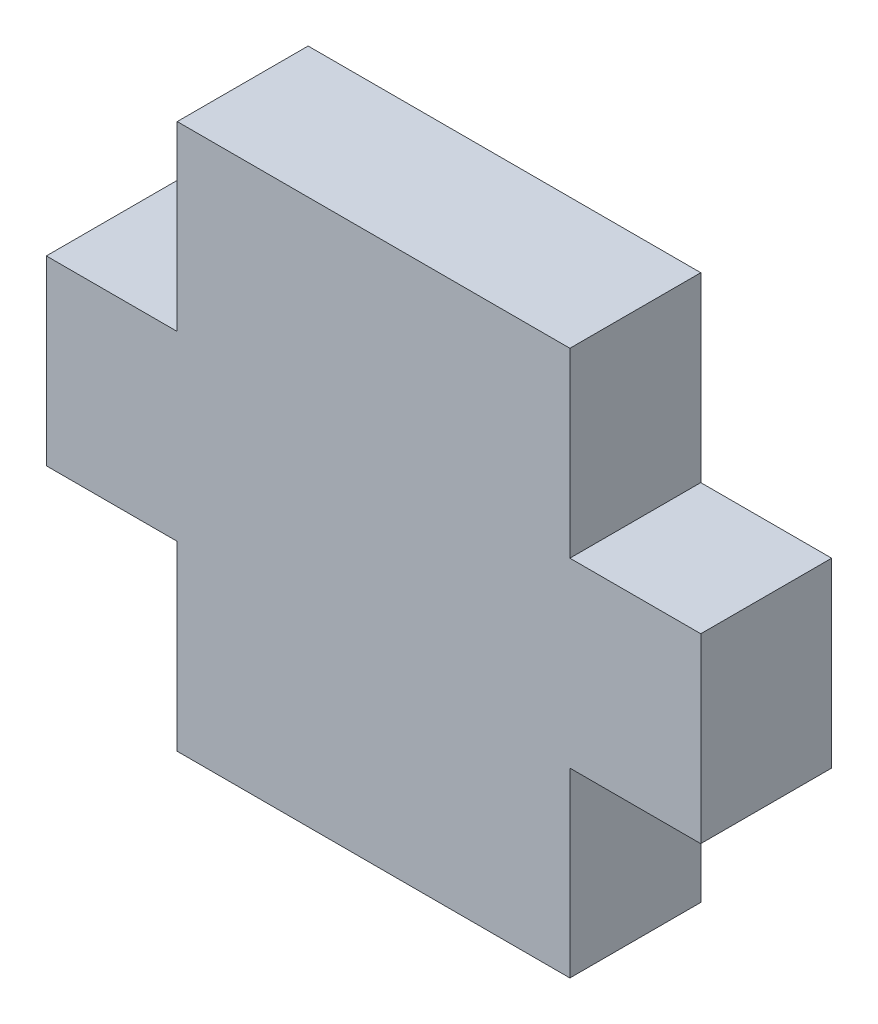
ISO-10303-21;
HEADER;
FILE_DESCRIPTION(('STEP AP214'),'2;1');
FILE_NAME('part.step','',(''),(''),'','','');
FILE_SCHEMA(('AUTOMOTIVE_DESIGN { 1 0 10303 214 1 1 1 1 }'));
ENDSEC;
DATA;
#1=APPLICATION_CONTEXT('core data for automotive mechanical design processes');
#2=APPLICATION_PROTOCOL_DEFINITION('international standard','automotive_design',2000,#1);
#3=PRODUCT_CONTEXT('',#1,'mechanical');
#4=PRODUCT('Part','Part','',(#3));
#5=PRODUCT_RELATED_PRODUCT_CATEGORY('part','',(#4));
#6=PRODUCT_DEFINITION_FORMATION('','',#4);
#7=PRODUCT_DEFINITION_CONTEXT('part definition',#1,'design');
#8=PRODUCT_DEFINITION('design','',#6,#7);
#9=PRODUCT_DEFINITION_SHAPE('','',#8);
#10=(LENGTH_UNIT() NAMED_UNIT(*) SI_UNIT(.MILLI.,.METRE.));
#11=(NAMED_UNIT(*) PLANE_ANGLE_UNIT() SI_UNIT($,.RADIAN.));
#12=(NAMED_UNIT(*) SI_UNIT($,.STERADIAN.) SOLID_ANGLE_UNIT());
#13=UNCERTAINTY_MEASURE_WITH_UNIT(LENGTH_MEASURE(1.E-05),#10,'distance_accuracy_value','');
#14=(GEOMETRIC_REPRESENTATION_CONTEXT(3) GLOBAL_UNCERTAINTY_ASSIGNED_CONTEXT((#13)) GLOBAL_UNIT_ASSIGNED_CONTEXT((#10,
#11,#12)) REPRESENTATION_CONTEXT('',''));
#15=CARTESIAN_POINT('',(0.,0.,0.));
#16=DIRECTION('',(0.,0.,1.));
#17=DIRECTION('',(1.,0.,0.));
#18=AXIS2_PLACEMENT_3D('',#15,#16,#17);
#19=CARTESIAN_POINT('',(0.,0.,15.24));
#20=DIRECTION('',(1.,0.,0.));
#21=DIRECTION('',(0.,0.,-1.));
#22=AXIS2_PLACEMENT_3D('',#19,#20,#21);
#23=PLANE('',#22);
#24=DIRECTION('',(0.,-1.,0.));
#25=VECTOR('',#24,1.);
#26=CARTESIAN_POINT('',(0.,0.,0.));
#27=LINE('',#26,#25);
#28=CARTESIAN_POINT('',(0.,42.3333333333333,0.));
#29=VERTEX_POINT('',#28);
#30=CARTESIAN_POINT('',(0.,21.1666666666667,0.));
#31=VERTEX_POINT('',#30);
#32=EDGE_CURVE('E150',#29,#31,#27,.T.);
#33=ORIENTED_EDGE('',*,*,#32,.T.);
#34=DIRECTION('',(0.,0.,1.));
#35=VECTOR('',#34,1.);
#36=CARTESIAN_POINT('',(0.,21.1666666666667,0.));
#37=LINE('',#36,#35);
#38=CARTESIAN_POINT('',(0.,21.1666666666667,15.24));
#39=VERTEX_POINT('',#38);
#40=EDGE_CURVE('E175',#31,#39,#37,.T.);
#41=ORIENTED_EDGE('',*,*,#40,.T.);
#42=DIRECTION('',(0.,-1.,0.));
#43=VECTOR('',#42,1.);
#44=CARTESIAN_POINT('',(0.,0.,15.24));
#45=LINE('',#44,#43);
#46=CARTESIAN_POINT('',(0.,42.3333333333333,15.24));
#47=VERTEX_POINT('',#46);
#48=EDGE_CURVE('E148',#47,#39,#45,.T.);
#49=ORIENTED_EDGE('',*,*,#48,.F.);
#50=DIRECTION('',(0.,0.,1.));
#51=VECTOR('',#50,1.);
#52=CARTESIAN_POINT('',(0.,42.3333333333333,0.));
#53=LINE('',#52,#51);
#54=EDGE_CURVE('E162',#29,#47,#53,.T.);
#55=ORIENTED_EDGE('',*,*,#54,.F.);
#56=EDGE_LOOP('',(#33,#41,#49,#55));
#57=FACE_BOUND('',#56,.T.);
#58=ADVANCED_FACE('F33',(#57),#23,.F.);
#59=CARTESIAN_POINT('',(0.,0.,15.24));
#60=DIRECTION('',(0.,1.,0.));
#61=DIRECTION('',(0.,0.,1.));
#62=AXIS2_PLACEMENT_3D('',#59,#60,#61);
#63=PLANE('',#62);
#64=DIRECTION('',(1.,0.,0.));
#65=VECTOR('',#64,1.);
#66=CARTESIAN_POINT('',(0.,0.,15.24));
#67=LINE('',#66,#65);
#68=CARTESIAN_POINT('',(15.24,0.,15.24));
#69=VERTEX_POINT('',#68);
#70=CARTESIAN_POINT('',(60.96,0.,15.24));
#71=VERTEX_POINT('',#70);
#72=EDGE_CURVE('E157',#69,#71,#67,.T.);
#73=ORIENTED_EDGE('',*,*,#72,.F.);
#74=DIRECTION('',(0.,0.,1.));
#75=VECTOR('',#74,1.);
#76=CARTESIAN_POINT('',(15.24,0.,0.));
#77=LINE('',#76,#75);
#78=CARTESIAN_POINT('',(15.24,0.,0.));
#79=VERTEX_POINT('',#78);
#80=EDGE_CURVE('E196',#79,#69,#77,.T.);
#81=ORIENTED_EDGE('',*,*,#80,.F.);
#82=DIRECTION('',(1.,0.,0.));
#83=VECTOR('',#82,1.);
#84=CARTESIAN_POINT('',(0.,0.,0.));
#85=LINE('',#84,#83);
#86=CARTESIAN_POINT('',(60.96,0.,0.));
#87=VERTEX_POINT('',#86);
#88=EDGE_CURVE('E146',#79,#87,#85,.T.);
#89=ORIENTED_EDGE('',*,*,#88,.T.);
#90=DIRECTION('',(0.,0.,1.));
#91=VECTOR('',#90,1.);
#92=CARTESIAN_POINT('',(60.96,0.,0.));
#93=LINE('',#92,#91);
#94=EDGE_CURVE('E193',#87,#71,#93,.T.);
#95=ORIENTED_EDGE('',*,*,#94,.T.);
#96=EDGE_LOOP('',(#73,#81,#89,#95));
#97=FACE_BOUND('',#96,.T.);
#98=ADVANCED_FACE('F221',(#97),#63,.F.);
#99=CARTESIAN_POINT('',(76.2,0.,15.24));
#100=DIRECTION('',(-1.,0.,0.));
#101=DIRECTION('',(0.,0.,1.));
#102=AXIS2_PLACEMENT_3D('',#99,#100,#101);
#103=PLANE('',#102);
#104=DIRECTION('',(0.,1.,0.));
#105=VECTOR('',#104,1.);
#106=CARTESIAN_POINT('',(76.2,0.,0.));
#107=LINE('',#106,#105);
#108=CARTESIAN_POINT('',(76.2,21.1666666666667,0.));
#109=VERTEX_POINT('',#108);
#110=CARTESIAN_POINT('',(76.2,42.3333333333333,0.));
#111=VERTEX_POINT('',#110);
#112=EDGE_CURVE('E141',#109,#111,#107,.T.);
#113=ORIENTED_EDGE('',*,*,#112,.T.);
#114=DIRECTION('',(0.,0.,1.));
#115=VECTOR('',#114,1.);
#116=CARTESIAN_POINT('',(76.2,42.3333333333333,0.));
#117=LINE('',#116,#115);
#118=CARTESIAN_POINT('',(76.2,42.3333333333333,15.24));
#119=VERTEX_POINT('',#118);
#120=EDGE_CURVE('E184',#111,#119,#117,.T.);
#121=ORIENTED_EDGE('',*,*,#120,.T.);
#122=DIRECTION('',(0.,1.,0.));
#123=VECTOR('',#122,1.);
#124=CARTESIAN_POINT('',(76.2,0.,15.24));
#125=LINE('',#124,#123);
#126=CARTESIAN_POINT('',(76.2,21.1666666666667,15.24));
#127=VERTEX_POINT('',#126);
#128=EDGE_CURVE('E41',#127,#119,#125,.T.);
#129=ORIENTED_EDGE('',*,*,#128,.F.);
#130=DIRECTION('',(0.,0.,1.));
#131=VECTOR('',#130,1.);
#132=CARTESIAN_POINT('',(76.2,21.1666666666667,0.));
#133=LINE('',#132,#131);
#134=EDGE_CURVE('E127',#109,#127,#133,.T.);
#135=ORIENTED_EDGE('',*,*,#134,.F.);
#136=EDGE_LOOP('',(#113,#121,#129,#135));
#137=FACE_BOUND('',#136,.T.);
#138=ADVANCED_FACE('F139',(#137),#103,.F.);
#139=CARTESIAN_POINT('',(0.,63.5,15.24));
#140=DIRECTION('',(0.,-1.,0.));
#141=DIRECTION('',(0.,0.,-1.));
#142=AXIS2_PLACEMENT_3D('',#139,#140,#141);
#143=PLANE('',#142);
#144=DIRECTION('',(-1.,0.,0.));
#145=VECTOR('',#144,1.);
#146=CARTESIAN_POINT('',(0.,63.5,15.24));
#147=LINE('',#146,#145);
#148=CARTESIAN_POINT('',(60.96,63.5,15.24));
#149=VERTEX_POINT('',#148);
#150=CARTESIAN_POINT('',(15.24,63.5,15.24));
#151=VERTEX_POINT('',#150);
#152=EDGE_CURVE('E11',#149,#151,#147,.T.);
#153=ORIENTED_EDGE('',*,*,#152,.F.);
#154=DIRECTION('',(0.,0.,1.));
#155=VECTOR('',#154,1.);
#156=CARTESIAN_POINT('',(60.96,63.5,0.));
#157=LINE('',#156,#155);
#158=CARTESIAN_POINT('',(60.96,63.5,0.));
#159=VERTEX_POINT('',#158);
#160=EDGE_CURVE('E180',#159,#149,#157,.T.);
#161=ORIENTED_EDGE('',*,*,#160,.F.);
#162=DIRECTION('',(-1.,0.,0.));
#163=VECTOR('',#162,1.);
#164=CARTESIAN_POINT('',(0.,63.5,0.));
#165=LINE('',#164,#163);
#166=CARTESIAN_POINT('',(15.24,63.5,0.));
#167=VERTEX_POINT('',#166);
#168=EDGE_CURVE('E36',#159,#167,#165,.T.);
#169=ORIENTED_EDGE('',*,*,#168,.T.);
#170=DIRECTION('',(0.,0.,1.));
#171=VECTOR('',#170,1.);
#172=CARTESIAN_POINT('',(15.24,63.5,0.));
#173=LINE('',#172,#171);
#174=EDGE_CURVE('E154',#167,#151,#173,.T.);
#175=ORIENTED_EDGE('',*,*,#174,.T.);
#176=EDGE_LOOP('',(#153,#161,#169,#175));
#177=FACE_BOUND('',#176,.T.);
#178=ADVANCED_FACE('F244',(#177),#143,.F.);
#179=CARTESIAN_POINT('',(0.,0.,15.24));
#180=DIRECTION('',(0.,0.,-1.));
#181=DIRECTION('',(-1.,0.,0.));
#182=AXIS2_PLACEMENT_3D('',#179,#180,#181);
#183=PLANE('',#182);
#184=ORIENTED_EDGE('',*,*,#48,.T.);
#185=DIRECTION('',(-1.,0.,0.));
#186=VECTOR('',#185,1.);
#187=CARTESIAN_POINT('',(0.,21.1666666666667,15.24));
#188=LINE('',#187,#186);
#189=CARTESIAN_POINT('',(15.24,21.1666666666667,15.24));
#190=VERTEX_POINT('',#189);
#191=EDGE_CURVE('E202',#190,#39,#188,.T.);
#192=ORIENTED_EDGE('',*,*,#191,.F.);
#193=DIRECTION('',(0.,1.,0.));
#194=VECTOR('',#193,1.);
#195=CARTESIAN_POINT('',(15.24,0.,15.24));
#196=LINE('',#195,#194);
#197=EDGE_CURVE('E186',#69,#190,#196,.T.);
#198=ORIENTED_EDGE('',*,*,#197,.F.);
#199=ORIENTED_EDGE('',*,*,#72,.T.);
#200=DIRECTION('',(0.,-1.,0.));
#201=VECTOR('',#200,1.);
#202=CARTESIAN_POINT('',(60.96,21.1666666666667,15.24));
#203=LINE('',#202,#201);
#204=CARTESIAN_POINT('',(60.96,21.1666666666667,15.24));
#205=VERTEX_POINT('',#204);
#206=EDGE_CURVE('E134',#205,#71,#203,.T.);
#207=ORIENTED_EDGE('',*,*,#206,.F.);
#208=DIRECTION('',(-1.,0.,0.));
#209=VECTOR('',#208,1.);
#210=CARTESIAN_POINT('',(76.2,21.1666666666667,15.24));
#211=LINE('',#210,#209);
#212=EDGE_CURVE('E214',#127,#205,#211,.T.);
#213=ORIENTED_EDGE('',*,*,#212,.F.);
#214=ORIENTED_EDGE('',*,*,#128,.T.);
#215=DIRECTION('',(1.,0.,0.));
#216=VECTOR('',#215,1.);
#217=CARTESIAN_POINT('',(76.2,42.3333333333333,15.24));
#218=LINE('',#217,#216);
#219=CARTESIAN_POINT('',(60.96,42.3333333333333,15.24));
#220=VERTEX_POINT('',#219);
#221=EDGE_CURVE('E187',#220,#119,#218,.T.);
#222=ORIENTED_EDGE('',*,*,#221,.F.);
#223=DIRECTION('',(0.,-1.,0.));
#224=VECTOR('',#223,1.);
#225=CARTESIAN_POINT('',(60.96,63.5,15.24));
#226=LINE('',#225,#224);
#227=EDGE_CURVE('E190',#149,#220,#226,.T.);
#228=ORIENTED_EDGE('',*,*,#227,.F.);
#229=ORIENTED_EDGE('',*,*,#152,.T.);
#230=DIRECTION('',(0.,1.,0.));
#231=VECTOR('',#230,1.);
#232=CARTESIAN_POINT('',(15.24,63.5,15.24));
#233=LINE('',#232,#231);
#234=CARTESIAN_POINT('',(15.24,42.3333333333333,15.24));
#235=VERTEX_POINT('',#234);
#236=EDGE_CURVE('E169',#235,#151,#233,.T.);
#237=ORIENTED_EDGE('',*,*,#236,.F.);
#238=DIRECTION('',(1.,0.,0.));
#239=VECTOR('',#238,1.);
#240=CARTESIAN_POINT('',(0.,42.3333333333333,15.24));
#241=LINE('',#240,#239);
#242=EDGE_CURVE('E172',#47,#235,#241,.T.);
#243=ORIENTED_EDGE('',*,*,#242,.F.);
#244=EDGE_LOOP('',(#184,#192,#198,#199,#207,#213,#214,#222,#228,#229,#237,#243));
#245=FACE_BOUND('',#244,.T.);
#246=ADVANCED_FACE('F227',(#245),#183,.F.);
#247=CARTESIAN_POINT('',(0.,0.,0.));
#248=DIRECTION('',(0.,0.,-1.));
#249=DIRECTION('',(-1.,0.,0.));
#250=AXIS2_PLACEMENT_3D('',#247,#248,#249);
#251=PLANE('',#250);
#252=DIRECTION('',(-1.,0.,0.));
#253=VECTOR('',#252,1.);
#254=CARTESIAN_POINT('',(0.,21.1666666666667,0.));
#255=LINE('',#254,#253);
#256=CARTESIAN_POINT('',(15.24,21.1666666666667,0.));
#257=VERTEX_POINT('',#256);
#258=EDGE_CURVE('E49',#257,#31,#255,.T.);
#259=ORIENTED_EDGE('',*,*,#258,.T.);
#260=ORIENTED_EDGE('',*,*,#32,.F.);
#261=DIRECTION('',(1.,0.,0.));
#262=VECTOR('',#261,1.);
#263=CARTESIAN_POINT('',(0.,42.3333333333333,0.));
#264=LINE('',#263,#262);
#265=CARTESIAN_POINT('',(15.24,42.3333333333333,0.));
#266=VERTEX_POINT('',#265);
#267=EDGE_CURVE('E171',#29,#266,#264,.T.);
#268=ORIENTED_EDGE('',*,*,#267,.T.);
#269=DIRECTION('',(0.,1.,0.));
#270=VECTOR('',#269,1.);
#271=CARTESIAN_POINT('',(15.24,63.5,0.));
#272=LINE('',#271,#270);
#273=EDGE_CURVE('E165',#266,#167,#272,.T.);
#274=ORIENTED_EDGE('',*,*,#273,.T.);
#275=ORIENTED_EDGE('',*,*,#168,.F.);
#276=DIRECTION('',(0.,-1.,0.));
#277=VECTOR('',#276,1.);
#278=CARTESIAN_POINT('',(60.96,63.5,0.));
#279=LINE('',#278,#277);
#280=CARTESIAN_POINT('',(60.96,42.3333333333333,0.));
#281=VERTEX_POINT('',#280);
#282=EDGE_CURVE('E189',#159,#281,#279,.T.);
#283=ORIENTED_EDGE('',*,*,#282,.T.);
#284=DIRECTION('',(1.,0.,0.));
#285=VECTOR('',#284,1.);
#286=CARTESIAN_POINT('',(76.2,42.3333333333333,0.));
#287=LINE('',#286,#285);
#288=EDGE_CURVE('E57',#281,#111,#287,.T.);
#289=ORIENTED_EDGE('',*,*,#288,.T.);
#290=ORIENTED_EDGE('',*,*,#112,.F.);
#291=DIRECTION('',(-1.,0.,0.));
#292=VECTOR('',#291,1.);
#293=CARTESIAN_POINT('',(76.2,21.1666666666667,0.));
#294=LINE('',#293,#292);
#295=CARTESIAN_POINT('',(60.96,21.1666666666667,0.));
#296=VERTEX_POINT('',#295);
#297=EDGE_CURVE('E123',#109,#296,#294,.T.);
#298=ORIENTED_EDGE('',*,*,#297,.T.);
#299=DIRECTION('',(0.,-1.,0.));
#300=VECTOR('',#299,1.);
#301=CARTESIAN_POINT('',(60.96,21.1666666666667,0.));
#302=LINE('',#301,#300);
#303=EDGE_CURVE('E133',#296,#87,#302,.T.);
#304=ORIENTED_EDGE('',*,*,#303,.T.);
#305=ORIENTED_EDGE('',*,*,#88,.F.);
#306=DIRECTION('',(0.,1.,0.));
#307=VECTOR('',#306,1.);
#308=CARTESIAN_POINT('',(15.24,0.,0.));
#309=LINE('',#308,#307);
#310=EDGE_CURVE('E204',#79,#257,#309,.T.);
#311=ORIENTED_EDGE('',*,*,#310,.T.);
#312=EDGE_LOOP('',(#259,#260,#268,#274,#275,#283,#289,#290,#298,#304,#305,#311));
#313=FACE_BOUND('',#312,.T.);
#314=ADVANCED_FACE('F144',(#313),#251,.T.);
#315=CARTESIAN_POINT('',(15.24,63.5,0.));
#316=DIRECTION('',(1.,0.,0.));
#317=DIRECTION('',(0.,1.,0.));
#318=AXIS2_PLACEMENT_3D('',#315,#316,#317);
#319=PLANE('',#318);
#320=ORIENTED_EDGE('',*,*,#236,.T.);
#321=ORIENTED_EDGE('',*,*,#174,.F.);
#322=ORIENTED_EDGE('',*,*,#273,.F.);
#323=DIRECTION('',(0.,0.,1.));
#324=VECTOR('',#323,1.);
#325=CARTESIAN_POINT('',(15.24,42.3333333333333,0.));
#326=LINE('',#325,#324);
#327=EDGE_CURVE('E164',#266,#235,#326,.T.);
#328=ORIENTED_EDGE('',*,*,#327,.T.);
#329=EDGE_LOOP('',(#320,#321,#322,#328));
#330=FACE_BOUND('',#329,.T.);
#331=ADVANCED_FACE('F241',(#330),#319,.F.);
#332=CARTESIAN_POINT('',(0.,42.3333333333333,0.));
#333=DIRECTION('',(0.,-1.,0.));
#334=DIRECTION('',(1.,0.,0.));
#335=AXIS2_PLACEMENT_3D('',#332,#333,#334);
#336=PLANE('',#335);
#337=ORIENTED_EDGE('',*,*,#242,.T.);
#338=ORIENTED_EDGE('',*,*,#327,.F.);
#339=ORIENTED_EDGE('',*,*,#267,.F.);
#340=ORIENTED_EDGE('',*,*,#54,.T.);
#341=EDGE_LOOP('',(#337,#338,#339,#340));
#342=FACE_BOUND('',#341,.T.);
#343=ADVANCED_FACE('F238',(#342),#336,.F.);
#344=CARTESIAN_POINT('',(60.96,21.1666666666667,0.));
#345=DIRECTION('',(-1.,0.,0.));
#346=DIRECTION('',(0.,0.,1.));
#347=AXIS2_PLACEMENT_3D('',#344,#345,#346);
#348=PLANE('',#347);
#349=ORIENTED_EDGE('',*,*,#206,.T.);
#350=ORIENTED_EDGE('',*,*,#94,.F.);
#351=ORIENTED_EDGE('',*,*,#303,.F.);
#352=DIRECTION('',(0.,0.,1.));
#353=VECTOR('',#352,1.);
#354=CARTESIAN_POINT('',(60.96,21.1666666666667,0.));
#355=LINE('',#354,#353);
#356=EDGE_CURVE('E129',#296,#205,#355,.T.);
#357=ORIENTED_EDGE('',*,*,#356,.T.);
#358=EDGE_LOOP('',(#349,#350,#351,#357));
#359=FACE_BOUND('',#358,.T.);
#360=ADVANCED_FACE('F251',(#359),#348,.F.);
#361=CARTESIAN_POINT('',(76.2,21.1666666666667,0.));
#362=DIRECTION('',(0.,1.,0.));
#363=DIRECTION('',(-1.,0.,0.));
#364=AXIS2_PLACEMENT_3D('',#361,#362,#363);
#365=PLANE('',#364);
#366=ORIENTED_EDGE('',*,*,#212,.T.);
#367=ORIENTED_EDGE('',*,*,#356,.F.);
#368=ORIENTED_EDGE('',*,*,#297,.F.);
#369=ORIENTED_EDGE('',*,*,#134,.T.);
#370=EDGE_LOOP('',(#366,#367,#368,#369));
#371=FACE_BOUND('',#370,.T.);
#372=ADVANCED_FACE('F126',(#371),#365,.F.);
#373=CARTESIAN_POINT('',(76.2,42.3333333333333,0.));
#374=DIRECTION('',(0.,-1.,0.));
#375=DIRECTION('',(0.,0.,-1.));
#376=AXIS2_PLACEMENT_3D('',#373,#374,#375);
#377=PLANE('',#376);
#378=ORIENTED_EDGE('',*,*,#221,.T.);
#379=ORIENTED_EDGE('',*,*,#120,.F.);
#380=ORIENTED_EDGE('',*,*,#288,.F.);
#381=DIRECTION('',(0.,0.,1.));
#382=VECTOR('',#381,1.);
#383=CARTESIAN_POINT('',(60.96,42.3333333333333,0.));
#384=LINE('',#383,#382);
#385=EDGE_CURVE('E182',#281,#220,#384,.T.);
#386=ORIENTED_EDGE('',*,*,#385,.T.);
#387=EDGE_LOOP('',(#378,#379,#380,#386));
#388=FACE_BOUND('',#387,.T.);
#389=ADVANCED_FACE('F250',(#388),#377,.F.);
#390=CARTESIAN_POINT('',(60.96,63.5,0.));
#391=DIRECTION('',(-1.,0.,0.));
#392=DIRECTION('',(0.,0.,1.));
#393=AXIS2_PLACEMENT_3D('',#390,#391,#392);
#394=PLANE('',#393);
#395=ORIENTED_EDGE('',*,*,#227,.T.);
#396=ORIENTED_EDGE('',*,*,#385,.F.);
#397=ORIENTED_EDGE('',*,*,#282,.F.);
#398=ORIENTED_EDGE('',*,*,#160,.T.);
#399=EDGE_LOOP('',(#395,#396,#397,#398));
#400=FACE_BOUND('',#399,.T.);
#401=ADVANCED_FACE('F249',(#400),#394,.F.);
#402=CARTESIAN_POINT('',(0.,21.1666666666667,0.));
#403=DIRECTION('',(0.,1.,0.));
#404=DIRECTION('',(0.,0.,1.));
#405=AXIS2_PLACEMENT_3D('',#402,#403,#404);
#406=PLANE('',#405);
#407=ORIENTED_EDGE('',*,*,#191,.T.);
#408=ORIENTED_EDGE('',*,*,#40,.F.);
#409=ORIENTED_EDGE('',*,*,#258,.F.);
#410=DIRECTION('',(0.,0.,1.));
#411=VECTOR('',#410,1.);
#412=CARTESIAN_POINT('',(15.24,21.1666666666667,0.));
#413=LINE('',#412,#411);
#414=EDGE_CURVE('E198',#257,#190,#413,.T.);
#415=ORIENTED_EDGE('',*,*,#414,.T.);
#416=EDGE_LOOP('',(#407,#408,#409,#415));
#417=FACE_BOUND('',#416,.T.);
#418=ADVANCED_FACE('F231',(#417),#406,.F.);
#419=CARTESIAN_POINT('',(15.24,0.,0.));
#420=DIRECTION('',(1.,0.,0.));
#421=DIRECTION('',(0.,1.,0.));
#422=AXIS2_PLACEMENT_3D('',#419,#420,#421);
#423=PLANE('',#422);
#424=ORIENTED_EDGE('',*,*,#197,.T.);
#425=ORIENTED_EDGE('',*,*,#414,.F.);
#426=ORIENTED_EDGE('',*,*,#310,.F.);
#427=ORIENTED_EDGE('',*,*,#80,.T.);
#428=EDGE_LOOP('',(#424,#425,#426,#427));
#429=FACE_BOUND('',#428,.T.);
#430=ADVANCED_FACE('F224',(#429),#423,.F.);
#431=CLOSED_SHELL('',(#58,#98,#138,#178,#246,#314,#331,#343,#360,#372,#389,#401,#418,#430));
#432=MANIFOLD_SOLID_BREP('B2',#431);
#433=ADVANCED_BREP_SHAPE_REPRESENTATION('',(#18,#432),#14);
#434=SHAPE_DEFINITION_REPRESENTATION(#9,#433);
ENDSEC;
END-ISO-10303-21;
